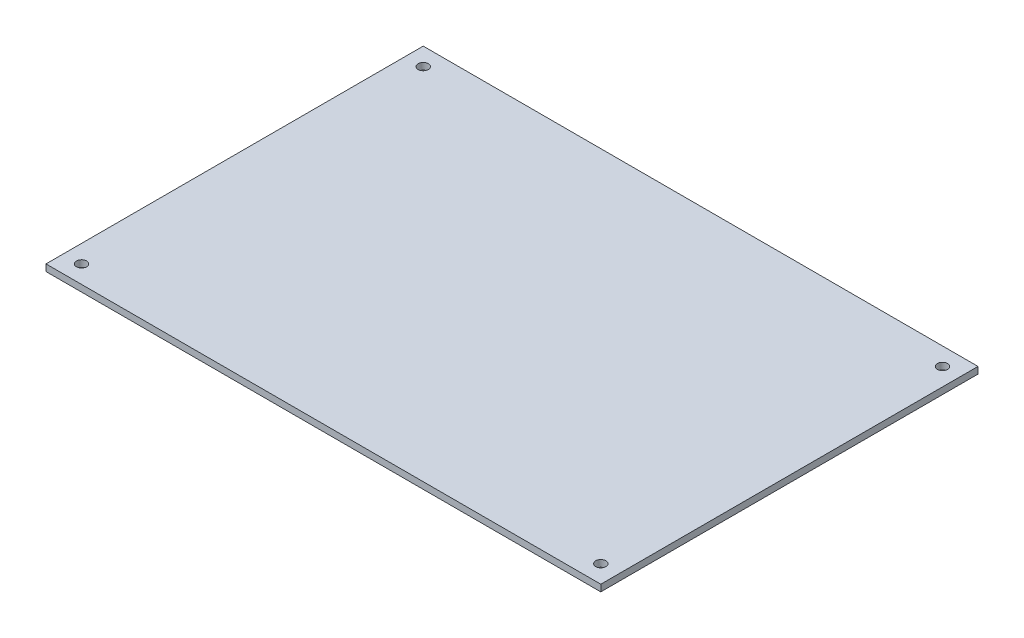
ISO-10303-21;
HEADER;
FILE_DESCRIPTION(('STEP AP214'),'2;1');
FILE_NAME('part.step','',(''),(''),'','','');
FILE_SCHEMA(('AUTOMOTIVE_DESIGN { 1 0 10303 214 1 1 1 1 }'));
ENDSEC;
DATA;
#1=APPLICATION_CONTEXT('core data for automotive mechanical design processes');
#2=APPLICATION_PROTOCOL_DEFINITION('international standard','automotive_design',2000,#1);
#3=PRODUCT_CONTEXT('',#1,'mechanical');
#4=PRODUCT('Part','Part','',(#3));
#5=PRODUCT_RELATED_PRODUCT_CATEGORY('part','',(#4));
#6=PRODUCT_DEFINITION_FORMATION('','',#4);
#7=PRODUCT_DEFINITION_CONTEXT('part definition',#1,'design');
#8=PRODUCT_DEFINITION('design','',#6,#7);
#9=PRODUCT_DEFINITION_SHAPE('','',#8);
#10=(LENGTH_UNIT() NAMED_UNIT(*) SI_UNIT(.MILLI.,.METRE.));
#11=(NAMED_UNIT(*) PLANE_ANGLE_UNIT() SI_UNIT($,.RADIAN.));
#12=(NAMED_UNIT(*) SI_UNIT($,.STERADIAN.) SOLID_ANGLE_UNIT());
#13=UNCERTAINTY_MEASURE_WITH_UNIT(LENGTH_MEASURE(1.E-05),#10,'distance_accuracy_value','');
#14=(GEOMETRIC_REPRESENTATION_CONTEXT(3) GLOBAL_UNCERTAINTY_ASSIGNED_CONTEXT((#13)) GLOBAL_UNIT_ASSIGNED_CONTEXT((#10,
#11,#12)) REPRESENTATION_CONTEXT('',''));
#15=CARTESIAN_POINT('',(0.,0.,0.));
#16=DIRECTION('',(0.,0.,1.));
#17=DIRECTION('',(1.,0.,0.));
#18=AXIS2_PLACEMENT_3D('',#15,#16,#17);
#19=CARTESIAN_POINT('',(-166.74596088933,-0.0018,-19.4026611754623));
#20=DIRECTION('',(-1.,0.,0.));
#21=DIRECTION('',(0.,0.,1.));
#22=AXIS2_PLACEMENT_3D('',#19,#20,#21);
#23=PLANE('',#22);
#24=DIRECTION('',(0.,1.,0.));
#25=VECTOR('',#24,1.);
#26=CARTESIAN_POINT('',(-166.74596088933,-0.0018,65.5824831580105));
#27=LINE('',#26,#25);
#28=CARTESIAN_POINT('',(-166.74596088933,-0.0018,65.5824831580105));
#29=VERTEX_POINT('',#28);
#30=CARTESIAN_POINT('',(-166.74596088933,1.5,65.5824831580105));
#31=VERTEX_POINT('',#30);
#32=EDGE_CURVE('E36',#29,#31,#27,.T.);
#33=ORIENTED_EDGE('',*,*,#32,.T.);
#34=DIRECTION('',(0.,0.,1.));
#35=VECTOR('',#34,1.);
#36=CARTESIAN_POINT('',(-166.74596088933,1.5,-19.4026611754623));
#37=LINE('',#36,#35);
#38=CARTESIAN_POINT('',(-166.74596088933,1.5,-19.4026611754623));
#39=VERTEX_POINT('',#38);
#40=EDGE_CURVE('E73',#39,#31,#37,.T.);
#41=ORIENTED_EDGE('',*,*,#40,.F.);
#42=DIRECTION('',(0.,1.,0.));
#43=VECTOR('',#42,1.);
#44=CARTESIAN_POINT('',(-166.74596088933,-0.0018,-19.4026611754623));
#45=LINE('',#44,#43);
#46=CARTESIAN_POINT('',(-166.74596088933,-0.0018,-19.4026611754623));
#47=VERTEX_POINT('',#46);
#48=EDGE_CURVE('E11',#47,#39,#45,.T.);
#49=ORIENTED_EDGE('',*,*,#48,.F.);
#50=DIRECTION('',(0.,0.,1.));
#51=VECTOR('',#50,1.);
#52=CARTESIAN_POINT('',(-166.74596088933,-0.0018,-19.4026611754623));
#53=LINE('',#52,#51);
#54=EDGE_CURVE('E74',#47,#29,#53,.T.);
#55=ORIENTED_EDGE('',*,*,#54,.T.);
#56=EDGE_LOOP('',(#33,#41,#49,#55));
#57=FACE_BOUND('',#56,.T.);
#58=ADVANCED_FACE('F33',(#57),#23,.T.);
#59=CARTESIAN_POINT('',(-166.74596088933,-0.0018,-19.4026611754623));
#60=DIRECTION('',(0.,0.,-1.));
#61=DIRECTION('',(-1.,0.,0.));
#62=AXIS2_PLACEMENT_3D('',#59,#60,#61);
#63=PLANE('',#62);
#64=ORIENTED_EDGE('',*,*,#48,.T.);
#65=DIRECTION('',(-1.,0.,0.));
#66=VECTOR('',#65,1.);
#67=CARTESIAN_POINT('',(-166.74596088933,1.5,-19.4026611754623));
#68=LINE('',#67,#66);
#69=CARTESIAN_POINT('',(-41.7538679164586,1.5,-19.4026611754623));
#70=VERTEX_POINT('',#69);
#71=EDGE_CURVE('E90',#70,#39,#68,.T.);
#72=ORIENTED_EDGE('',*,*,#71,.F.);
#73=DIRECTION('',(0.,1.,0.));
#74=VECTOR('',#73,1.);
#75=CARTESIAN_POINT('',(-41.7538679164586,-0.0018,-19.4026611754623));
#76=LINE('',#75,#74);
#77=CARTESIAN_POINT('',(-41.7538679164586,-0.0018,-19.4026611754623));
#78=VERTEX_POINT('',#77);
#79=EDGE_CURVE('E41',#78,#70,#76,.T.);
#80=ORIENTED_EDGE('',*,*,#79,.F.);
#81=DIRECTION('',(-1.,0.,0.));
#82=VECTOR('',#81,1.);
#83=CARTESIAN_POINT('',(-166.74596088933,-0.0018,-19.4026611754623));
#84=LINE('',#83,#82);
#85=EDGE_CURVE('E79',#78,#47,#84,.T.);
#86=ORIENTED_EDGE('',*,*,#85,.T.);
#87=EDGE_LOOP('',(#64,#72,#80,#86));
#88=FACE_BOUND('',#87,.T.);
#89=ADVANCED_FACE('F110',(#88),#63,.T.);
#90=CARTESIAN_POINT('',(-41.7538679164586,-0.0018,-19.4026611754623));
#91=DIRECTION('',(1.,0.,0.));
#92=DIRECTION('',(0.,0.,-1.));
#93=AXIS2_PLACEMENT_3D('',#90,#91,#92);
#94=PLANE('',#93);
#95=ORIENTED_EDGE('',*,*,#79,.T.);
#96=DIRECTION('',(0.,0.,-1.));
#97=VECTOR('',#96,1.);
#98=CARTESIAN_POINT('',(-41.7538679164586,1.5,-19.4026611754623));
#99=LINE('',#98,#97);
#100=CARTESIAN_POINT('',(-41.7538679164586,1.5,65.5824831580105));
#101=VERTEX_POINT('',#100);
#102=EDGE_CURVE('E86',#101,#70,#99,.T.);
#103=ORIENTED_EDGE('',*,*,#102,.F.);
#104=DIRECTION('',(0.,1.,0.));
#105=VECTOR('',#104,1.);
#106=CARTESIAN_POINT('',(-41.7538679164586,-0.0018,65.5824831580105));
#107=LINE('',#106,#105);
#108=CARTESIAN_POINT('',(-41.7538679164586,-0.0018,65.5824831580105));
#109=VERTEX_POINT('',#108);
#110=EDGE_CURVE('E78',#109,#101,#107,.T.);
#111=ORIENTED_EDGE('',*,*,#110,.F.);
#112=DIRECTION('',(0.,0.,-1.));
#113=VECTOR('',#112,1.);
#114=CARTESIAN_POINT('',(-41.7538679164586,-0.0018,-19.4026611754623));
#115=LINE('',#114,#113);
#116=EDGE_CURVE('E103',#109,#78,#115,.T.);
#117=ORIENTED_EDGE('',*,*,#116,.T.);
#118=EDGE_LOOP('',(#95,#103,#111,#117));
#119=FACE_BOUND('',#118,.T.);
#120=ADVANCED_FACE('F107',(#119),#94,.T.);
#121=CARTESIAN_POINT('',(-166.74596088933,-0.0018,65.5824831580105));
#122=DIRECTION('',(0.,0.,1.));
#123=DIRECTION('',(1.,0.,0.));
#124=AXIS2_PLACEMENT_3D('',#121,#122,#123);
#125=PLANE('',#124);
#126=ORIENTED_EDGE('',*,*,#110,.T.);
#127=DIRECTION('',(1.,0.,0.));
#128=VECTOR('',#127,1.);
#129=CARTESIAN_POINT('',(-166.74596088933,1.5,65.5824831580105));
#130=LINE('',#129,#128);
#131=EDGE_CURVE('E81',#31,#101,#130,.T.);
#132=ORIENTED_EDGE('',*,*,#131,.F.);
#133=ORIENTED_EDGE('',*,*,#32,.F.);
#134=DIRECTION('',(1.,0.,0.));
#135=VECTOR('',#134,1.);
#136=CARTESIAN_POINT('',(-166.74596088933,-0.0018,65.5824831580105));
#137=LINE('',#136,#135);
#138=EDGE_CURVE('E101',#29,#109,#137,.T.);
#139=ORIENTED_EDGE('',*,*,#138,.T.);
#140=EDGE_LOOP('',(#126,#132,#133,#139));
#141=FACE_BOUND('',#140,.T.);
#142=ADVANCED_FACE('F82',(#141),#125,.T.);
#143=CARTESIAN_POINT('',(0.,-0.0018,0.));
#144=DIRECTION('',(0.,1.,0.));
#145=DIRECTION('',(0.,0.,1.));
#146=AXIS2_PLACEMENT_3D('',#143,#144,#145);
#147=PLANE('',#146);
#148=CARTESIAN_POINT('',(-45.7538679164586,-0.0018,61.5824831580105));
#149=DIRECTION('',(0.,1.,0.));
#150=DIRECTION('',(0.,0.,1.));
#151=AXIS2_PLACEMENT_3D('',#148,#149,#150);
#152=CIRCLE('',#151,1.15);
#153=CARTESIAN_POINT('',(-45.7538679164586,-0.0018,62.7324831580105));
#154=VERTEX_POINT('',#153);
#155=EDGE_CURVE('E198',#154,#154,#152,.T.);
#156=ORIENTED_EDGE('',*,*,#155,.T.);
#157=EDGE_LOOP('',(#156));
#158=FACE_BOUND('',#157,.T.);
#159=CARTESIAN_POINT('',(-45.7538679164586,-0.0018,-15.4026611754623));
#160=DIRECTION('',(0.,1.,0.));
#161=DIRECTION('',(0.,0.,1.));
#162=AXIS2_PLACEMENT_3D('',#159,#160,#161);
#163=CIRCLE('',#162,1.15);
#164=CARTESIAN_POINT('',(-45.7538679164586,-0.0018,-14.2526611754623));
#165=VERTEX_POINT('',#164);
#166=EDGE_CURVE('E202',#165,#165,#163,.T.);
#167=ORIENTED_EDGE('',*,*,#166,.T.);
#168=EDGE_LOOP('',(#167));
#169=FACE_BOUND('',#168,.T.);
#170=CARTESIAN_POINT('',(-162.74596088933,-0.00179999999999972,-15.4026611754623));
#171=DIRECTION('',(0.,1.,0.));
#172=DIRECTION('',(0.,0.,1.));
#173=AXIS2_PLACEMENT_3D('',#170,#171,#172);
#174=CIRCLE('',#173,1.15000000000002);
#175=CARTESIAN_POINT('',(-162.74596088933,-0.00179999999999972,-14.2526611754623));
#176=VERTEX_POINT('',#175);
#177=EDGE_CURVE('E211',#176,#176,#174,.T.);
#178=ORIENTED_EDGE('',*,*,#177,.T.);
#179=EDGE_LOOP('',(#178));
#180=FACE_BOUND('',#179,.T.);
#181=CARTESIAN_POINT('',(-162.74596088933,-0.00180000000000015,61.5824831580105));
#182=DIRECTION('',(0.,1.,0.));
#183=DIRECTION('',(0.,0.,1.));
#184=AXIS2_PLACEMENT_3D('',#181,#182,#183);
#185=CIRCLE('',#184,1.15000000000002);
#186=CARTESIAN_POINT('',(-162.74596088933,-0.00180000000000015,62.7324831580105));
#187=VERTEX_POINT('',#186);
#188=EDGE_CURVE('E91',#187,#187,#185,.T.);
#189=ORIENTED_EDGE('',*,*,#188,.T.);
#190=EDGE_LOOP('',(#189));
#191=FACE_BOUND('',#190,.T.);
#192=ORIENTED_EDGE('',*,*,#54,.F.);
#193=ORIENTED_EDGE('',*,*,#85,.F.);
#194=ORIENTED_EDGE('',*,*,#116,.F.);
#195=ORIENTED_EDGE('',*,*,#138,.F.);
#196=EDGE_LOOP('',(#192,#193,#194,#195));
#197=FACE_BOUND('',#196,.T.);
#198=ADVANCED_FACE('F112',(#158,#169,#180,#191,#197),#147,.F.);
#199=CARTESIAN_POINT('',(0.,1.5,0.));
#200=DIRECTION('',(0.,1.,0.));
#201=DIRECTION('',(0.,0.,1.));
#202=AXIS2_PLACEMENT_3D('',#199,#200,#201);
#203=PLANE('',#202);
#204=CARTESIAN_POINT('',(-45.7538679164586,1.5,61.5824831580105));
#205=DIRECTION('',(0.,1.,0.));
#206=DIRECTION('',(0.,0.,1.));
#207=AXIS2_PLACEMENT_3D('',#204,#205,#206);
#208=CIRCLE('',#207,1.15);
#209=CARTESIAN_POINT('',(-45.7538679164586,1.5,62.7324831580105));
#210=VERTEX_POINT('',#209);
#211=EDGE_CURVE('E196',#210,#210,#208,.T.);
#212=ORIENTED_EDGE('',*,*,#211,.F.);
#213=EDGE_LOOP('',(#212));
#214=FACE_BOUND('',#213,.T.);
#215=CARTESIAN_POINT('',(-45.7538679164586,1.5,-15.4026611754623));
#216=DIRECTION('',(0.,1.,0.));
#217=DIRECTION('',(0.,0.,1.));
#218=AXIS2_PLACEMENT_3D('',#215,#216,#217);
#219=CIRCLE('',#218,1.15);
#220=CARTESIAN_POINT('',(-45.7538679164586,1.5,-14.2526611754623));
#221=VERTEX_POINT('',#220);
#222=EDGE_CURVE('E199',#221,#221,#219,.T.);
#223=ORIENTED_EDGE('',*,*,#222,.F.);
#224=EDGE_LOOP('',(#223));
#225=FACE_BOUND('',#224,.T.);
#226=CARTESIAN_POINT('',(-162.74596088933,1.5,-15.4026611754623));
#227=DIRECTION('',(0.,1.,0.));
#228=DIRECTION('',(0.,0.,1.));
#229=AXIS2_PLACEMENT_3D('',#226,#227,#228);
#230=CIRCLE('',#229,1.15000000000002);
#231=CARTESIAN_POINT('',(-162.74596088933,1.5,-14.2526611754623));
#232=VERTEX_POINT('',#231);
#233=EDGE_CURVE('E208',#232,#232,#230,.T.);
#234=ORIENTED_EDGE('',*,*,#233,.F.);
#235=EDGE_LOOP('',(#234));
#236=FACE_BOUND('',#235,.T.);
#237=CARTESIAN_POINT('',(-162.74596088933,1.5,61.5824831580105));
#238=DIRECTION('',(0.,1.,0.));
#239=DIRECTION('',(0.,0.,1.));
#240=AXIS2_PLACEMENT_3D('',#237,#238,#239);
#241=CIRCLE('',#240,1.15000000000002);
#242=CARTESIAN_POINT('',(-162.74596088933,1.5,62.7324831580105));
#243=VERTEX_POINT('',#242);
#244=EDGE_CURVE('E94',#243,#243,#241,.T.);
#245=ORIENTED_EDGE('',*,*,#244,.F.);
#246=EDGE_LOOP('',(#245));
#247=FACE_BOUND('',#246,.T.);
#248=ORIENTED_EDGE('',*,*,#40,.T.);
#249=ORIENTED_EDGE('',*,*,#131,.T.);
#250=ORIENTED_EDGE('',*,*,#102,.T.);
#251=ORIENTED_EDGE('',*,*,#71,.T.);
#252=EDGE_LOOP('',(#248,#249,#250,#251));
#253=FACE_BOUND('',#252,.T.);
#254=ADVANCED_FACE('F89',(#214,#225,#236,#247,#253),#203,.T.);
#255=CARTESIAN_POINT('',(-162.74596088933,-3.52908616400755,61.5824831580105));
#256=DIRECTION('',(0.,1.,0.));
#257=DIRECTION('',(0.,0.,1.));
#258=AXIS2_PLACEMENT_3D('',#255,#256,#257);
#259=CYLINDRICAL_SURFACE('',#258,1.15000000000002);
#260=ORIENTED_EDGE('',*,*,#244,.T.);
#261=EDGE_LOOP('',(#260));
#262=FACE_BOUND('',#261,.T.);
#263=ORIENTED_EDGE('',*,*,#188,.F.);
#264=EDGE_LOOP('',(#263));
#265=FACE_BOUND('',#264,.T.);
#266=ADVANCED_FACE('F120',(#262,#265),#259,.F.);
#267=CARTESIAN_POINT('',(-162.74596088933,-11.5,-15.4026611754623));
#268=DIRECTION('',(0.,1.,0.));
#269=DIRECTION('',(0.,0.,1.));
#270=AXIS2_PLACEMENT_3D('',#267,#268,#269);
#271=CYLINDRICAL_SURFACE('',#270,1.15000000000002);
#272=ORIENTED_EDGE('',*,*,#233,.T.);
#273=EDGE_LOOP('',(#272));
#274=FACE_BOUND('',#273,.T.);
#275=ORIENTED_EDGE('',*,*,#177,.F.);
#276=EDGE_LOOP('',(#275));
#277=FACE_BOUND('',#276,.T.);
#278=ADVANCED_FACE('F150',(#274,#277),#271,.F.);
#279=CARTESIAN_POINT('',(-45.7538679164586,-0.0774395413272594,-15.4026611754623));
#280=DIRECTION('',(0.,1.,0.));
#281=DIRECTION('',(0.,0.,1.));
#282=AXIS2_PLACEMENT_3D('',#279,#280,#281);
#283=CYLINDRICAL_SURFACE('',#282,1.15);
#284=ORIENTED_EDGE('',*,*,#222,.T.);
#285=EDGE_LOOP('',(#284));
#286=FACE_BOUND('',#285,.T.);
#287=ORIENTED_EDGE('',*,*,#166,.F.);
#288=EDGE_LOOP('',(#287));
#289=FACE_BOUND('',#288,.T.);
#290=ADVANCED_FACE('F161',(#286,#289),#283,.F.);
#291=CARTESIAN_POINT('',(-45.7538679164586,-0.01,61.5824831580105));
#292=DIRECTION('',(0.,1.,0.));
#293=DIRECTION('',(0.,0.,1.));
#294=AXIS2_PLACEMENT_3D('',#291,#292,#293);
#295=CYLINDRICAL_SURFACE('',#294,1.15);
#296=CARTESIAN_POINT('',(-45.7538679164586,1.5,62.7324831580105));
#297=CARTESIAN_POINT('',(-45.7538679164586,1.48435625,62.7324831580105));
#298=CARTESIAN_POINT('',(-45.7538679164586,1.4687125,62.7324831580105));
#299=CARTESIAN_POINT('',(-45.7538679164586,1.437425,62.7324831580105));
#300=CARTESIAN_POINT('',(-45.7538679164586,1.42178125,62.7324831580105));
#301=CARTESIAN_POINT('',(-45.7538679164586,1.39049375,62.7324831580105));
#302=CARTESIAN_POINT('',(-45.7538679164586,1.37485,62.7324831580105));
#303=CARTESIAN_POINT('',(-45.7538679164586,1.3435625,62.7324831580105));
#304=CARTESIAN_POINT('',(-45.7538679164586,1.32791875,62.7324831580105));
#305=CARTESIAN_POINT('',(-45.7538679164586,1.29663125,62.7324831580105));
#306=CARTESIAN_POINT('',(-45.7538679164586,1.2809875,62.7324831580105));
#307=CARTESIAN_POINT('',(-45.7538679164586,1.2497,62.7324831580105));
#308=CARTESIAN_POINT('',(-45.7538679164586,1.23405625,62.7324831580105));
#309=CARTESIAN_POINT('',(-45.7538679164586,1.20276875,62.7324831580105));
#310=CARTESIAN_POINT('',(-45.7538679164586,1.187125,62.7324831580105));
#311=CARTESIAN_POINT('',(-45.7538679164586,1.1558375,62.7324831580105));
#312=CARTESIAN_POINT('',(-45.7538679164586,1.14019375,62.7324831580105));
#313=CARTESIAN_POINT('',(-45.7538679164586,1.10890625,62.7324831580105));
#314=CARTESIAN_POINT('',(-45.7538679164586,1.0932625,62.7324831580105));
#315=CARTESIAN_POINT('',(-45.7538679164586,1.061975,62.7324831580105));
#316=CARTESIAN_POINT('',(-45.7538679164586,1.04633125,62.7324831580105));
#317=CARTESIAN_POINT('',(-45.7538679164586,1.01504375,62.7324831580105));
#318=CARTESIAN_POINT('',(-45.7538679164586,0.9994,62.7324831580105));
#319=CARTESIAN_POINT('',(-45.7538679164586,0.9681125,62.7324831580105));
#320=CARTESIAN_POINT('',(-45.7538679164586,0.95246875,62.7324831580105));
#321=CARTESIAN_POINT('',(-45.7538679164586,0.92118125,62.7324831580105));
#322=CARTESIAN_POINT('',(-45.7538679164586,0.9055375,62.7324831580105));
#323=CARTESIAN_POINT('',(-45.7538679164586,0.87425,62.7324831580105));
#324=CARTESIAN_POINT('',(-45.7538679164586,0.85860625,62.7324831580105));
#325=CARTESIAN_POINT('',(-45.7538679164586,0.82731875,62.7324831580105));
#326=CARTESIAN_POINT('',(-45.7538679164586,0.811675,62.7324831580105));
#327=CARTESIAN_POINT('',(-45.7538679164586,0.7803875,62.7324831580105));
#328=CARTESIAN_POINT('',(-45.7538679164586,0.76474375,62.7324831580105));
#329=CARTESIAN_POINT('',(-45.7538679164586,0.73345625,62.7324831580105));
#330=CARTESIAN_POINT('',(-45.7538679164586,0.7178125,62.7324831580105));
#331=CARTESIAN_POINT('',(-45.7538679164586,0.686525,62.7324831580105));
#332=CARTESIAN_POINT('',(-45.7538679164586,0.67088125,62.7324831580105));
#333=CARTESIAN_POINT('',(-45.7538679164586,0.63959375,62.7324831580105));
#334=CARTESIAN_POINT('',(-45.7538679164586,0.62395,62.7324831580105));
#335=CARTESIAN_POINT('',(-45.7538679164586,0.5926625,62.7324831580105));
#336=CARTESIAN_POINT('',(-45.7538679164586,0.57701875,62.7324831580105));
#337=CARTESIAN_POINT('',(-45.7538679164586,0.54573125,62.7324831580105));
#338=CARTESIAN_POINT('',(-45.7538679164586,0.5300875,62.7324831580105));
#339=CARTESIAN_POINT('',(-45.7538679164586,0.4988,62.7324831580105));
#340=CARTESIAN_POINT('',(-45.7538679164586,0.48315625,62.7324831580105));
#341=CARTESIAN_POINT('',(-45.7538679164586,0.45186875,62.7324831580105));
#342=CARTESIAN_POINT('',(-45.7538679164586,0.436225,62.7324831580105));
#343=CARTESIAN_POINT('',(-45.7538679164586,0.4049375,62.7324831580105));
#344=CARTESIAN_POINT('',(-45.7538679164586,0.38929375,62.7324831580105));
#345=CARTESIAN_POINT('',(-45.7538679164586,0.35800625,62.7324831580105));
#346=CARTESIAN_POINT('',(-45.7538679164586,0.3423625,62.7324831580105));
#347=CARTESIAN_POINT('',(-45.7538679164586,0.311075,62.7324831580105));
#348=CARTESIAN_POINT('',(-45.7538679164586,0.29543125,62.7324831580105));
#349=CARTESIAN_POINT('',(-45.7538679164586,0.26414375,62.7324831580105));
#350=CARTESIAN_POINT('',(-45.7538679164586,0.2485,62.7324831580105));
#351=CARTESIAN_POINT('',(-45.7538679164586,0.2172125,62.7324831580105));
#352=CARTESIAN_POINT('',(-45.7538679164586,0.20156875,62.7324831580105));
#353=CARTESIAN_POINT('',(-45.7538679164586,0.17028125,62.7324831580105));
#354=CARTESIAN_POINT('',(-45.7538679164586,0.1546375,62.7324831580105));
#355=CARTESIAN_POINT('',(-45.7538679164586,0.12335,62.7324831580105));
#356=CARTESIAN_POINT('',(-45.7538679164586,0.10770625,62.7324831580105));
#357=CARTESIAN_POINT('',(-45.7538679164586,0.0764187500000001,62.7324831580105));
#358=CARTESIAN_POINT('',(-45.7538679164586,0.060775,62.7324831580105));
#359=CARTESIAN_POINT('',(-45.7538679164586,0.0294875,62.7324831580105));
#360=CARTESIAN_POINT('',(-45.7538679164586,0.0138437500000001,62.7324831580105));
#361=CARTESIAN_POINT('',(-45.7538679164586,-0.00179999999999994,62.7324831580105));
#362=B_SPLINE_CURVE_WITH_KNOTS('',3,(#296,#297,#298,#299,#300,#301,#302,#303,#304,#305,#306,
#307,#308,#309,#310,#311,#312,#313,#314,#315,#316,#317,#318,#319,#320,#321,#322,#323,#324,#325,
#326,#327,#328,#329,#330,#331,#332,#333,#334,#335,#336,#337,#338,#339,#340,#341,#342,#343,#344,
#345,#346,#347,#348,#349,#350,#351,#352,#353,#354,#355,#356,#357,#358,#359,#360,#361),
.UNSPECIFIED.,.F.,.F.,(4,2,2,2,2,2,2,2,2,2,2,2,2,2,2,2,2,2,2,2,2,2,2,2,2,2,2,2,2,2,2,2,4),(0.,
0.0469312499999999,0.0938625000000001,0.14079375,0.187725,0.23465625,0.2815875,0.32851875,
0.37545,0.42238125,0.4693125,0.51624375,0.563175,0.61010625,0.6570375,0.70396875,0.7509,
0.79783125,0.8447625,0.89169375,0.938625,0.98555625,1.0324875,1.07941875,1.12635,1.17328125,
1.2202125,1.26714375,1.314075,1.36100625,1.4079375,1.45486875,1.5018),.UNSPECIFIED.);
#363=EDGE_CURVE('BSEAM170',#210,#154,#362,.T.);
#364=ORIENTED_EDGE('',*,*,#211,.T.);
#365=ORIENTED_EDGE('',*,*,#155,.F.);
#366=ORIENTED_EDGE('',*,*,#363,.T.);
#367=ORIENTED_EDGE('',*,*,#363,.F.);
#368=EDGE_LOOP('',(#364,#366,#365,#367));
#369=FACE_BOUND('',#368,.T.);
#370=ADVANCED_FACE('F170',(#369),#295,.F.);
#371=CLOSED_SHELL('',(#58,#89,#120,#142,#198,#254,#266,#278,#290,#370));
#372=MANIFOLD_SOLID_BREP('B2',#371);
#373=ADVANCED_BREP_SHAPE_REPRESENTATION('',(#18,#372),#14);
#374=SHAPE_DEFINITION_REPRESENTATION(#9,#373);
ENDSEC;
END-ISO-10303-21;
